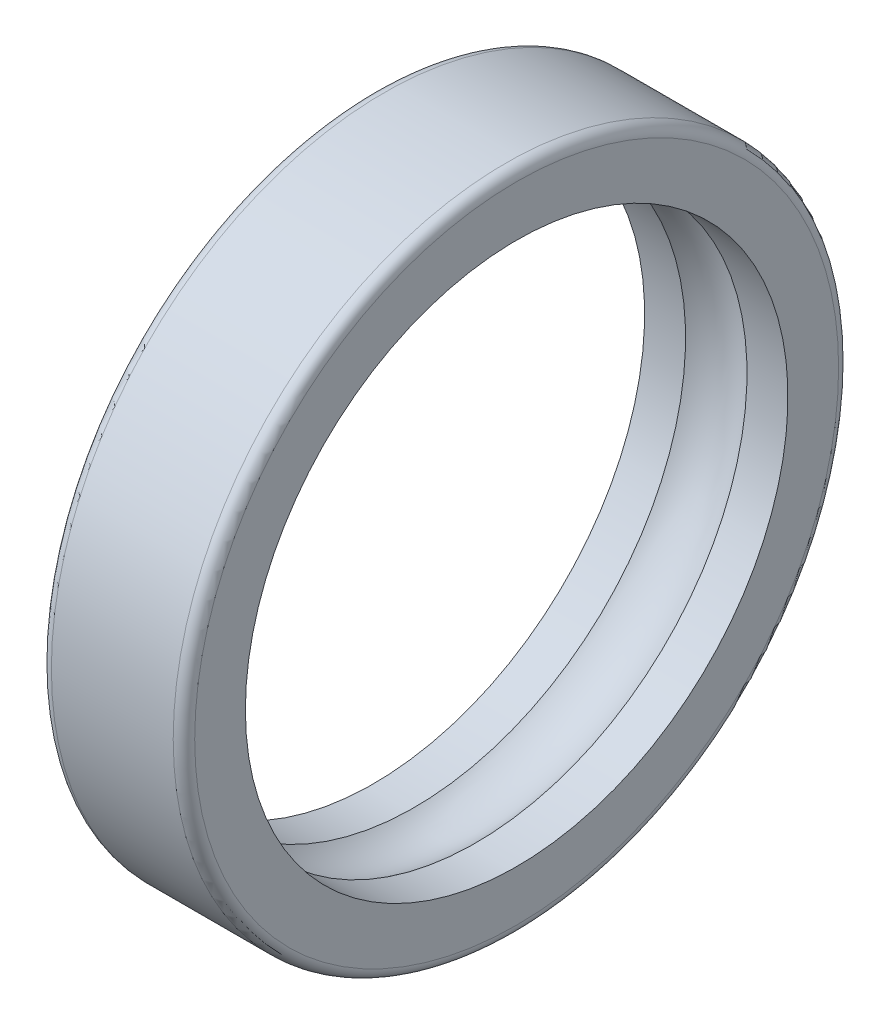
ISO-10303-21;
HEADER;
FILE_DESCRIPTION(('STEP AP214'),'2;1');
FILE_NAME('part.step','',(''),(''),'','','');
FILE_SCHEMA(('AUTOMOTIVE_DESIGN { 1 0 10303 214 1 1 1 1 }'));
ENDSEC;
DATA;
#1=APPLICATION_CONTEXT('core data for automotive mechanical design processes');
#2=APPLICATION_PROTOCOL_DEFINITION('international standard','automotive_design',2000,#1);
#3=PRODUCT_CONTEXT('',#1,'mechanical');
#4=PRODUCT('Part','Part','',(#3));
#5=PRODUCT_RELATED_PRODUCT_CATEGORY('part','',(#4));
#6=PRODUCT_DEFINITION_FORMATION('','',#4);
#7=PRODUCT_DEFINITION_CONTEXT('part definition',#1,'design');
#8=PRODUCT_DEFINITION('design','',#6,#7);
#9=PRODUCT_DEFINITION_SHAPE('','',#8);
#10=(LENGTH_UNIT() NAMED_UNIT(*) SI_UNIT(.MILLI.,.METRE.));
#11=(NAMED_UNIT(*) PLANE_ANGLE_UNIT() SI_UNIT($,.RADIAN.));
#12=(NAMED_UNIT(*) SI_UNIT($,.STERADIAN.) SOLID_ANGLE_UNIT());
#13=UNCERTAINTY_MEASURE_WITH_UNIT(LENGTH_MEASURE(1.E-05),#10,'distance_accuracy_value','');
#14=(GEOMETRIC_REPRESENTATION_CONTEXT(3) GLOBAL_UNCERTAINTY_ASSIGNED_CONTEXT((#13)) GLOBAL_UNIT_ASSIGNED_CONTEXT((#10,
#11,#12)) REPRESENTATION_CONTEXT('',''));
#15=CARTESIAN_POINT('',(0.,0.,0.));
#16=DIRECTION('',(0.,0.,1.));
#17=DIRECTION('',(1.,0.,0.));
#18=AXIS2_PLACEMENT_3D('',#15,#16,#17);
#19=CARTESIAN_POINT('',(-24.5928081256261,0.,0.));
#20=DIRECTION('',(-1.,0.,0.));
#21=DIRECTION('',(0.,0.,1.));
#22=AXIS2_PLACEMENT_3D('',#19,#20,#21);
#23=CYLINDRICAL_SURFACE('',#22,53.);
#24=CARTESIAN_POINT('',(14.,0.,0.));
#25=DIRECTION('',(-1.,0.,0.));
#26=DIRECTION('',(0.,0.,1.));
#27=AXIS2_PLACEMENT_3D('',#24,#25,#26);
#28=CIRCLE('',#27,53.);
#29=CARTESIAN_POINT('',(14.,0.,53.));
#30=VERTEX_POINT('',#29);
#31=EDGE_CURVE('E61',#30,#30,#28,.T.);
#32=ORIENTED_EDGE('',*,*,#31,.F.);
#33=EDGE_LOOP('',(#32));
#34=FACE_BOUND('',#33,.T.);
#35=CARTESIAN_POINT('',(6.,0.,0.));
#36=DIRECTION('',(-1.,0.,0.));
#37=DIRECTION('',(0.,0.,1.));
#38=AXIS2_PLACEMENT_3D('',#35,#36,#37);
#39=CIRCLE('',#38,53.);
#40=CARTESIAN_POINT('',(6.,0.,53.));
#41=VERTEX_POINT('',#40);
#42=EDGE_CURVE('E52',#41,#41,#39,.T.);
#43=ORIENTED_EDGE('',*,*,#42,.T.);
#44=EDGE_LOOP('',(#43));
#45=FACE_BOUND('',#44,.T.);
#46=ADVANCED_FACE('F32',(#34,#45),#23,.F.);
#47=CARTESIAN_POINT('',(0.,0.,0.));
#48=DIRECTION('',(-1.,0.,0.));
#49=DIRECTION('',(0.,0.,1.));
#50=AXIS2_PLACEMENT_3D('',#47,#48,#49);
#51=TOROIDAL_SURFACE('',#50,45.,10.);
#52=ORIENTED_EDGE('',*,*,#42,.F.);
#53=EDGE_LOOP('',(#52));
#54=FACE_BOUND('',#53,.T.);
#55=CARTESIAN_POINT('',(-6.,0.,0.));
#56=DIRECTION('',(-1.,0.,0.));
#57=DIRECTION('',(0.,0.,1.));
#58=AXIS2_PLACEMENT_3D('',#55,#56,#57);
#59=CIRCLE('',#58,53.);
#60=CARTESIAN_POINT('',(-6.,0.,53.));
#61=VERTEX_POINT('',#60);
#62=EDGE_CURVE('E55',#61,#61,#59,.T.);
#63=ORIENTED_EDGE('',*,*,#62,.T.);
#64=EDGE_LOOP('',(#63));
#65=FACE_BOUND('',#64,.T.);
#66=ADVANCED_FACE('F69',(#54,#65),#51,.F.);
#67=CARTESIAN_POINT('',(-24.5928081256261,0.,0.));
#68=DIRECTION('',(-1.,0.,0.));
#69=DIRECTION('',(0.,0.,1.));
#70=AXIS2_PLACEMENT_3D('',#67,#68,#69);
#71=CYLINDRICAL_SURFACE('',#70,53.);
#72=ORIENTED_EDGE('',*,*,#62,.F.);
#73=EDGE_LOOP('',(#72));
#74=FACE_BOUND('',#73,.T.);
#75=CARTESIAN_POINT('',(-14.,0.,0.));
#76=DIRECTION('',(-1.,0.,0.));
#77=DIRECTION('',(0.,0.,1.));
#78=AXIS2_PLACEMENT_3D('',#75,#76,#77);
#79=CIRCLE('',#78,53.);
#80=CARTESIAN_POINT('',(-14.,0.,53.));
#81=VERTEX_POINT('',#80);
#82=EDGE_CURVE('E58',#81,#81,#79,.T.);
#83=ORIENTED_EDGE('',*,*,#82,.T.);
#84=EDGE_LOOP('',(#83));
#85=FACE_BOUND('',#84,.T.);
#86=ADVANCED_FACE('F75',(#74,#85),#71,.F.);
#87=CARTESIAN_POINT('',(-14.,65.,0.));
#88=DIRECTION('',(1.,0.,0.));
#89=DIRECTION('',(0.,0.,-1.));
#90=AXIS2_PLACEMENT_3D('',#87,#88,#89);
#91=PLANE('',#90);
#92=CARTESIAN_POINT('',(-14.,0.,0.));
#93=DIRECTION('',(1.,0.,0.));
#94=DIRECTION('',(0.,0.,-1.));
#95=AXIS2_PLACEMENT_3D('',#92,#93,#94);
#96=CIRCLE('',#95,62.9);
#97=CARTESIAN_POINT('',(-14.,0.,-62.9));
#98=VERTEX_POINT('',#97);
#99=EDGE_CURVE('E10',#98,#98,#96,.F.);
#100=ORIENTED_EDGE('',*,*,#99,.T.);
#101=EDGE_LOOP('',(#100));
#102=FACE_BOUND('',#101,.T.);
#103=ORIENTED_EDGE('',*,*,#82,.F.);
#104=EDGE_LOOP('',(#103));
#105=FACE_BOUND('',#104,.T.);
#106=ADVANCED_FACE('F81',(#102,#105),#91,.F.);
#107=CARTESIAN_POINT('',(-24.5928081256261,0.,0.));
#108=DIRECTION('',(-1.,0.,0.));
#109=DIRECTION('',(0.,0.,1.));
#110=AXIS2_PLACEMENT_3D('',#107,#108,#109);
#111=CYLINDRICAL_SURFACE('',#110,65.);
#112=CARTESIAN_POINT('',(11.9,0.,0.));
#113=DIRECTION('',(-1.,0.,0.));
#114=DIRECTION('',(0.,0.,1.));
#115=AXIS2_PLACEMENT_3D('',#112,#113,#114);
#116=CIRCLE('',#115,65.);
#117=CARTESIAN_POINT('',(11.9,0.,65.));
#118=VERTEX_POINT('',#117);
#119=EDGE_CURVE('E43',#118,#118,#116,.T.);
#120=ORIENTED_EDGE('',*,*,#119,.T.);
#121=EDGE_LOOP('',(#120));
#122=FACE_BOUND('',#121,.T.);
#123=CARTESIAN_POINT('',(-11.9,0.,0.));
#124=DIRECTION('',(1.,0.,0.));
#125=DIRECTION('',(0.,0.,-1.));
#126=AXIS2_PLACEMENT_3D('',#123,#124,#125);
#127=CIRCLE('',#126,65.);
#128=CARTESIAN_POINT('',(-11.9,0.,-65.));
#129=VERTEX_POINT('',#128);
#130=EDGE_CURVE('E47',#129,#129,#127,.T.);
#131=ORIENTED_EDGE('',*,*,#130,.T.);
#132=EDGE_LOOP('',(#131));
#133=FACE_BOUND('',#132,.T.);
#134=ADVANCED_FACE('F86',(#122,#133),#111,.T.);
#135=CARTESIAN_POINT('',(14.,65.,0.));
#136=DIRECTION('',(-1.,0.,0.));
#137=DIRECTION('',(0.,0.,1.));
#138=AXIS2_PLACEMENT_3D('',#135,#136,#137);
#139=PLANE('',#138);
#140=CARTESIAN_POINT('',(14.,0.,0.));
#141=DIRECTION('',(-1.,0.,0.));
#142=DIRECTION('',(0.,0.,1.));
#143=AXIS2_PLACEMENT_3D('',#140,#141,#142);
#144=CIRCLE('',#143,62.9);
#145=CARTESIAN_POINT('',(14.,0.,62.9));
#146=VERTEX_POINT('',#145);
#147=EDGE_CURVE('E39',#146,#146,#144,.F.);
#148=ORIENTED_EDGE('',*,*,#147,.T.);
#149=EDGE_LOOP('',(#148));
#150=FACE_BOUND('',#149,.T.);
#151=ORIENTED_EDGE('',*,*,#31,.T.);
#152=EDGE_LOOP('',(#151));
#153=FACE_BOUND('',#152,.T.);
#154=ADVANCED_FACE('F65',(#150,#153),#139,.F.);
#155=CARTESIAN_POINT('',(11.9,0.,0.));
#156=DIRECTION('',(-1.,0.,0.));
#157=DIRECTION('',(0.,0.,1.));
#158=AXIS2_PLACEMENT_3D('',#155,#156,#157);
#159=TOROIDAL_SURFACE('',#158,62.9,2.1);
#160=ORIENTED_EDGE('',*,*,#147,.F.);
#161=EDGE_LOOP('',(#160));
#162=FACE_BOUND('',#161,.T.);
#163=ORIENTED_EDGE('',*,*,#119,.F.);
#164=EDGE_LOOP('',(#163));
#165=FACE_BOUND('',#164,.T.);
#166=ADVANCED_FACE('F94',(#162,#165),#159,.T.);
#167=CARTESIAN_POINT('',(-11.9,0.,0.));
#168=DIRECTION('',(1.,0.,0.));
#169=DIRECTION('',(0.,0.,-1.));
#170=AXIS2_PLACEMENT_3D('',#167,#168,#169);
#171=TOROIDAL_SURFACE('',#170,62.9,2.1);
#172=ORIENTED_EDGE('',*,*,#130,.F.);
#173=EDGE_LOOP('',(#172));
#174=FACE_BOUND('',#173,.T.);
#175=ORIENTED_EDGE('',*,*,#99,.F.);
#176=EDGE_LOOP('',(#175));
#177=FACE_BOUND('',#176,.T.);
#178=ADVANCED_FACE('F34',(#174,#177),#171,.T.);
#179=CLOSED_SHELL('',(#46,#66,#86,#106,#134,#154,#166,#178));
#180=MANIFOLD_SOLID_BREP('B2',#179);
#181=ADVANCED_BREP_SHAPE_REPRESENTATION('',(#18,#180),#14);
#182=SHAPE_DEFINITION_REPRESENTATION(#9,#181);
ENDSEC;
END-ISO-10303-21;
